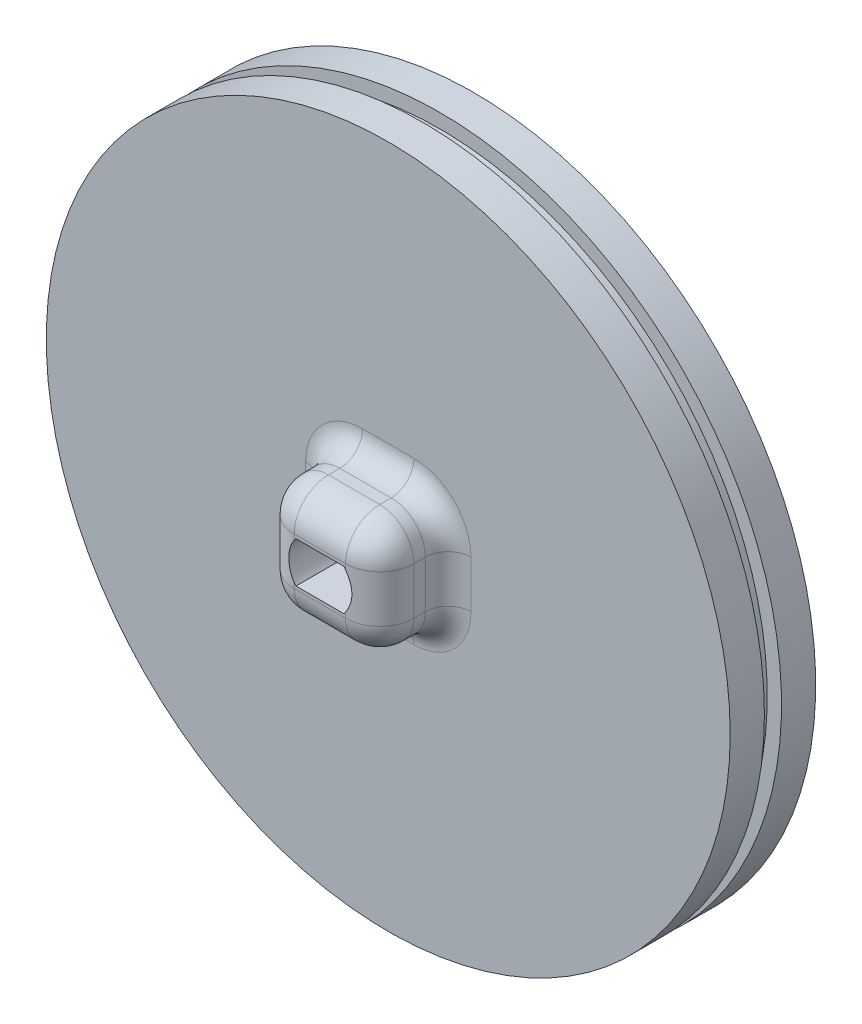
ISO-10303-21;
HEADER;
FILE_DESCRIPTION(('STEP AP214'),'2;1');
FILE_NAME('part.step','',(''),(''),'','','');
FILE_SCHEMA(('AUTOMOTIVE_DESIGN { 1 0 10303 214 1 1 1 1 }'));
ENDSEC;
DATA;
#1=APPLICATION_CONTEXT('core data for automotive mechanical design processes');
#2=APPLICATION_PROTOCOL_DEFINITION('international standard','automotive_design',2000,#1);
#3=PRODUCT_CONTEXT('',#1,'mechanical');
#4=PRODUCT('Part','Part','',(#3));
#5=PRODUCT_RELATED_PRODUCT_CATEGORY('part','',(#4));
#6=PRODUCT_DEFINITION_FORMATION('','',#4);
#7=PRODUCT_DEFINITION_CONTEXT('part definition',#1,'design');
#8=PRODUCT_DEFINITION('design','',#6,#7);
#9=PRODUCT_DEFINITION_SHAPE('','',#8);
#10=(LENGTH_UNIT() NAMED_UNIT(*) SI_UNIT(.MILLI.,.METRE.));
#11=(NAMED_UNIT(*) PLANE_ANGLE_UNIT() SI_UNIT($,.RADIAN.));
#12=(NAMED_UNIT(*) SI_UNIT($,.STERADIAN.) SOLID_ANGLE_UNIT());
#13=UNCERTAINTY_MEASURE_WITH_UNIT(LENGTH_MEASURE(1.E-05),#10,'distance_accuracy_value','');
#14=(GEOMETRIC_REPRESENTATION_CONTEXT(3) GLOBAL_UNCERTAINTY_ASSIGNED_CONTEXT((#13)) GLOBAL_UNIT_ASSIGNED_CONTEXT((#10,
#11,#12)) REPRESENTATION_CONTEXT('',''));
#15=CARTESIAN_POINT('',(0.,0.,0.));
#16=DIRECTION('',(0.,0.,1.));
#17=DIRECTION('',(1.,0.,0.));
#18=AXIS2_PLACEMENT_3D('',#15,#16,#17);
#19=CARTESIAN_POINT('',(0.,0.,9.));
#20=DIRECTION('',(0.,0.,1.));
#21=DIRECTION('',(1.,0.,0.));
#22=AXIS2_PLACEMENT_3D('',#19,#20,#21);
#23=PLANE('',#22);
#24=CARTESIAN_POINT('',(0.,0.,9.));
#25=DIRECTION('',(0.,0.,1.));
#26=DIRECTION('',(1.,0.,0.));
#27=AXIS2_PLACEMENT_3D('',#24,#25,#26);
#28=CIRCLE('',#27,2.76586333718787);
#29=CARTESIAN_POINT('',(-2.1,-1.8,9.));
#30=VERTEX_POINT('',#29);
#31=CARTESIAN_POINT('',(-2.25070691783825,-1.60758152825761,9.));
#32=VERTEX_POINT('',#31);
#33=EDGE_CURVE('E194',#30,#32,#28,.F.);
#34=ORIENTED_EDGE('',*,*,#33,.T.);
#35=DIRECTION('',(0.,1.,0.));
#36=VECTOR('',#35,1.);
#37=CARTESIAN_POINT('',(-2.25070691783825,0.,9.));
#38=LINE('',#37,#36);
#39=CARTESIAN_POINT('',(-2.25070691783825,-2.07228483810584,9.));
#40=VERTEX_POINT('',#39);
#41=EDGE_CURVE('E285',#32,#40,#38,.F.);
#42=ORIENTED_EDGE('',*,*,#41,.T.);
#43=DIRECTION('',(-1.,0.,0.));
#44=VECTOR('',#43,1.);
#45=CARTESIAN_POINT('',(0.,-2.07228483810584,9.));
#46=LINE('',#45,#44);
#47=CARTESIAN_POINT('',(2.25070691783825,-2.07228483810584,9.));
#48=VERTEX_POINT('',#47);
#49=EDGE_CURVE('E283',#40,#48,#46,.F.);
#50=ORIENTED_EDGE('',*,*,#49,.T.);
#51=DIRECTION('',(0.,1.,0.));
#52=VECTOR('',#51,1.);
#53=CARTESIAN_POINT('',(2.25070691783825,5.07228483810584,9.));
#54=LINE('',#53,#52);
#55=CARTESIAN_POINT('',(2.25070691783825,-1.60758152825761,9.));
#56=VERTEX_POINT('',#55);
#57=EDGE_CURVE('E281',#48,#56,#54,.T.);
#58=ORIENTED_EDGE('',*,*,#57,.T.);
#59=CARTESIAN_POINT('',(0.,0.,9.));
#60=DIRECTION('',(0.,0.,1.));
#61=DIRECTION('',(1.,0.,0.));
#62=AXIS2_PLACEMENT_3D('',#59,#60,#61);
#63=CIRCLE('',#62,2.76586333718787);
#64=CARTESIAN_POINT('',(2.1,-1.8,9.));
#65=VERTEX_POINT('',#64);
#66=EDGE_CURVE('E239',#56,#65,#63,.F.);
#67=ORIENTED_EDGE('',*,*,#66,.T.);
#68=DIRECTION('',(-1.,0.,0.));
#69=VECTOR('',#68,1.);
#70=CARTESIAN_POINT('',(0.,-1.8,9.));
#71=LINE('',#70,#69);
#72=EDGE_CURVE('E243',#65,#30,#71,.T.);
#73=ORIENTED_EDGE('',*,*,#72,.T.);
#74=EDGE_LOOP('',(#34,#42,#50,#58,#67,#73));
#75=FACE_BOUND('',#74,.T.);
#76=ADVANCED_FACE('F47',(#75),#23,.T.);
#77=CARTESIAN_POINT('',(0.,0.,3.));
#78=DIRECTION('',(0.,0.,-1.));
#79=DIRECTION('',(-1.,0.,0.));
#80=AXIS2_PLACEMENT_3D('',#77,#78,#79);
#81=CYLINDRICAL_SURFACE('',#80,30.);
#82=CARTESIAN_POINT('',(0.,0.,3.));
#83=DIRECTION('',(0.,0.,1.));
#84=DIRECTION('',(1.,0.,0.));
#85=AXIS2_PLACEMENT_3D('',#82,#83,#84);
#86=CIRCLE('',#85,30.);
#87=CARTESIAN_POINT('',(30.,0.,3.));
#88=VERTEX_POINT('',#87);
#89=EDGE_CURVE('E236',#88,#88,#86,.T.);
#90=ORIENTED_EDGE('',*,*,#89,.F.);
#91=EDGE_LOOP('',(#90));
#92=FACE_BOUND('',#91,.T.);
#93=CARTESIAN_POINT('',(0.,0.,0.));
#94=DIRECTION('',(0.,0.,1.));
#95=DIRECTION('',(1.,0.,0.));
#96=AXIS2_PLACEMENT_3D('',#93,#94,#95);
#97=CIRCLE('',#96,30.);
#98=CARTESIAN_POINT('',(30.,0.,0.));
#99=VERTEX_POINT('',#98);
#100=EDGE_CURVE('E248',#99,#99,#97,.T.);
#101=ORIENTED_EDGE('',*,*,#100,.T.);
#102=EDGE_LOOP('',(#101));
#103=FACE_BOUND('',#102,.T.);
#104=ADVANCED_FACE('F386',(#92,#103),#81,.T.);
#105=CARTESIAN_POINT('',(0.,0.,3.));
#106=DIRECTION('',(0.,0.,1.));
#107=DIRECTION('',(1.,0.,0.));
#108=AXIS2_PLACEMENT_3D('',#105,#106,#107);
#109=PLANE('',#108);
#110=DIRECTION('',(-1.,0.,0.));
#111=VECTOR('',#110,1.);
#112=CARTESIAN_POINT('',(0.,7.07228483810584,3.));
#113=LINE('',#112,#111);
#114=CARTESIAN_POINT('',(-2.25070691783825,7.07228483810584,3.));
#115=VERTEX_POINT('',#114);
#116=CARTESIAN_POINT('',(2.25070691783825,7.07228483810584,3.));
#117=VERTEX_POINT('',#116);
#118=EDGE_CURVE('E328',#115,#117,#113,.F.);
#119=ORIENTED_EDGE('',*,*,#118,.T.);
#120=CARTESIAN_POINT('',(2.25070691783825,2.07228483810584,3.));
#121=DIRECTION('',(0.,0.,1.));
#122=DIRECTION('',(1.,0.,0.));
#123=AXIS2_PLACEMENT_3D('',#120,#121,#122);
#124=CIRCLE('',#123,5.);
#125=CARTESIAN_POINT('',(7.25070691783825,2.07228483810584,3.));
#126=VERTEX_POINT('',#125);
#127=EDGE_CURVE('E467',#117,#126,#124,.F.);
#128=ORIENTED_EDGE('',*,*,#127,.T.);
#129=DIRECTION('',(0.,1.,0.));
#130=VECTOR('',#129,1.);
#131=CARTESIAN_POINT('',(7.25070691783825,0.,3.));
#132=LINE('',#131,#130);
#133=CARTESIAN_POINT('',(7.25070691783825,-2.07228483810584,3.));
#134=VERTEX_POINT('',#133);
#135=EDGE_CURVE('E465',#126,#134,#132,.F.);
#136=ORIENTED_EDGE('',*,*,#135,.T.);
#137=CARTESIAN_POINT('',(2.25070691783825,-2.07228483810584,3.));
#138=DIRECTION('',(0.,0.,1.));
#139=DIRECTION('',(1.,0.,0.));
#140=AXIS2_PLACEMENT_3D('',#137,#138,#139);
#141=CIRCLE('',#140,5.);
#142=CARTESIAN_POINT('',(2.25070691783825,-7.07228483810584,3.));
#143=VERTEX_POINT('',#142);
#144=EDGE_CURVE('E463',#134,#143,#141,.F.);
#145=ORIENTED_EDGE('',*,*,#144,.T.);
#146=DIRECTION('',(-1.,0.,0.));
#147=VECTOR('',#146,1.);
#148=CARTESIAN_POINT('',(-2.25070691783825,-7.07228483810584,3.));
#149=LINE('',#148,#147);
#150=CARTESIAN_POINT('',(-2.25070691783825,-7.07228483810584,3.));
#151=VERTEX_POINT('',#150);
#152=EDGE_CURVE('E461',#143,#151,#149,.T.);
#153=ORIENTED_EDGE('',*,*,#152,.T.);
#154=CARTESIAN_POINT('',(-2.25070691783825,-2.07228483810584,3.));
#155=DIRECTION('',(0.,0.,1.));
#156=DIRECTION('',(1.,0.,0.));
#157=AXIS2_PLACEMENT_3D('',#154,#155,#156);
#158=CIRCLE('',#157,5.);
#159=CARTESIAN_POINT('',(-7.25070691783825,-2.07228483810584,3.));
#160=VERTEX_POINT('',#159);
#161=EDGE_CURVE('E459',#151,#160,#158,.F.);
#162=ORIENTED_EDGE('',*,*,#161,.T.);
#163=DIRECTION('',(0.,1.,0.));
#164=VECTOR('',#163,1.);
#165=CARTESIAN_POINT('',(-7.25070691783825,2.07228483810584,3.));
#166=LINE('',#165,#164);
#167=CARTESIAN_POINT('',(-7.25070691783825,2.07228483810584,3.));
#168=VERTEX_POINT('',#167);
#169=EDGE_CURVE('E457',#160,#168,#166,.T.);
#170=ORIENTED_EDGE('',*,*,#169,.T.);
#171=CARTESIAN_POINT('',(-2.25070691783825,2.07228483810584,3.));
#172=DIRECTION('',(0.,0.,1.));
#173=DIRECTION('',(1.,0.,0.));
#174=AXIS2_PLACEMENT_3D('',#171,#172,#173);
#175=CIRCLE('',#174,5.);
#176=EDGE_CURVE('E455',#168,#115,#175,.F.);
#177=ORIENTED_EDGE('',*,*,#176,.T.);
#178=EDGE_LOOP('',(#119,#128,#136,#145,#153,#162,#170,#177));
#179=FACE_BOUND('',#178,.T.);
#180=ORIENTED_EDGE('',*,*,#89,.T.);
#181=EDGE_LOOP('',(#180));
#182=FACE_BOUND('',#181,.T.);
#183=ADVANCED_FACE('F317',(#179,#182),#109,.T.);
#184=CARTESIAN_POINT('',(0.,0.,0.));
#185=DIRECTION('',(0.,0.,1.));
#186=DIRECTION('',(1.,0.,0.));
#187=AXIS2_PLACEMENT_3D('',#184,#185,#186);
#188=PLANE('',#187);
#189=CARTESIAN_POINT('',(0.,0.,0.));
#190=DIRECTION('',(0.,0.,-1.));
#191=DIRECTION('',(-1.,0.,0.));
#192=AXIS2_PLACEMENT_3D('',#189,#190,#191);
#193=CIRCLE('',#192,28.75);
#194=CARTESIAN_POINT('',(-28.75,0.,0.));
#195=VERTEX_POINT('',#194);
#196=EDGE_CURVE('E232',#195,#195,#193,.T.);
#197=ORIENTED_EDGE('',*,*,#196,.F.);
#198=EDGE_LOOP('',(#197));
#199=FACE_BOUND('',#198,.T.);
#200=ORIENTED_EDGE('',*,*,#100,.F.);
#201=EDGE_LOOP('',(#200));
#202=FACE_BOUND('',#201,.T.);
#203=ADVANCED_FACE('F315',(#199,#202),#188,.F.);
#204=CARTESIAN_POINT('',(0.,0.,0.));
#205=DIRECTION('',(0.,0.,1.));
#206=DIRECTION('',(1.,0.,0.));
#207=AXIS2_PLACEMENT_3D('',#204,#205,#206);
#208=CYLINDRICAL_SURFACE('',#207,2.76586333718787);
#209=ORIENTED_EDGE('',*,*,#66,.F.);
#210=CARTESIAN_POINT('',(2.25070691783825,-1.60758152825761,9.));
#211=CARTESIAN_POINT('',(2.29579151730118,-1.54447324654785,8.99999076770363));
#212=CARTESIAN_POINT('',(2.33819924072402,-1.47947465190742,8.99898344435618));
#213=CARTESIAN_POINT('',(2.41739040970937,-1.34618758582439,8.99563035944665));
#214=CARTESIAN_POINT('',(2.45417513150772,-1.27789986554581,8.99328490217042));
#215=CARTESIAN_POINT('',(2.52187065480421,-1.13849586622718,8.98791267953742));
#216=CARTESIAN_POINT('',(2.55278143027582,-1.06737957465586,8.984885911162));
#217=CARTESIAN_POINT('',(2.60852412576171,-0.922827690382631,8.97871559453631));
#218=CARTESIAN_POINT('',(2.63335583147673,-0.849392016020883,8.97557204217366));
#219=CARTESIAN_POINT('',(2.69845737679608,-0.62631430754172,8.96673199214799));
#220=CARTESIAN_POINT('',(2.72938549330813,-0.473794586844061,8.96162044557408));
#221=CARTESIAN_POINT('',(2.76523983615542,-0.165808780765627,8.9556027990261));
#222=CARTESIAN_POINT('',(2.77018266697124,-0.0103446406189434,8.9546940135513));
#223=CARTESIAN_POINT('',(2.75404748101315,0.298237310513385,8.95748382936359));
#224=CARTESIAN_POINT('',(2.73312711232855,0.451363633596343,8.96115451789465));
#225=CARTESIAN_POINT('',(2.66613459131712,0.751953886793514,8.97128757643424));
#226=CARTESIAN_POINT('',(2.62006001199888,0.899417269052007,8.97775021581021));
#227=CARTESIAN_POINT('',(2.52142894124265,1.14195325084686,8.98803717837981));
#228=CARTESIAN_POINT('',(2.47491752875701,1.23952006053021,8.99207302801525));
#229=CARTESIAN_POINT('',(2.37089874274885,1.42845007106684,8.99803441253971));
#230=CARTESIAN_POINT('',(2.31341013414833,1.51982350311286,8.99996351152751));
#231=CARTESIAN_POINT('',(2.25070691783825,1.6075815282576,9.));
#232=B_SPLINE_CURVE_WITH_KNOTS('',3,(#210,#211,#212,#213,#214,#215,#216,#217,#218,#219,#220,
#221,#222,#223,#224,#225,#226,#227,#228,#229,#230,#231),.UNSPECIFIED.,.F.,.F.,(4,2,2,2,2,2,2,2,
2,2,4),(0.,0.23257344322412,0.465094021322319,0.69761562965846,0.930145433662444,
1.39485238838361,1.85926236132763,2.32085544687902,2.78249307688075,3.10626561289607,
3.42948955360998),.UNSPECIFIED.);
#233=CARTESIAN_POINT('',(2.25070691783825,1.6075815282576,9.));
#234=VERTEX_POINT('',#233);
#235=EDGE_CURVE('E320',#56,#234,#232,.T.);
#236=ORIENTED_EDGE('',*,*,#235,.T.);
#237=CARTESIAN_POINT('',(2.1,1.8,9.));
#238=VERTEX_POINT('',#237);
#239=EDGE_CURVE('E240',#238,#234,#63,.F.);
#240=ORIENTED_EDGE('',*,*,#239,.F.);
#241=DIRECTION('',(0.,0.,1.));
#242=VECTOR('',#241,1.);
#243=CARTESIAN_POINT('',(2.1,1.8,0.));
#244=LINE('',#243,#242);
#245=CARTESIAN_POINT('',(2.1,1.8,-4.5));
#246=VERTEX_POINT('',#245);
#247=EDGE_CURVE('E247',#246,#238,#244,.T.);
#248=ORIENTED_EDGE('',*,*,#247,.F.);
#249=CARTESIAN_POINT('',(0.,0.,-4.5));
#250=DIRECTION('',(0.,0.,1.));
#251=DIRECTION('',(-1.,0.,0.));
#252=AXIS2_PLACEMENT_3D('',#249,#250,#251);
#253=CIRCLE('',#252,2.76586333718787);
#254=CARTESIAN_POINT('',(2.1,-1.8,-4.5));
#255=VERTEX_POINT('',#254);
#256=EDGE_CURVE('E208',#255,#246,#253,.T.);
#257=ORIENTED_EDGE('',*,*,#256,.F.);
#258=DIRECTION('',(0.,0.,1.));
#259=VECTOR('',#258,1.);
#260=CARTESIAN_POINT('',(2.1,-1.8,0.));
#261=LINE('',#260,#259);
#262=EDGE_CURVE('E198',#255,#65,#261,.T.);
#263=ORIENTED_EDGE('',*,*,#262,.T.);
#264=EDGE_LOOP('',(#209,#236,#240,#248,#257,#263));
#265=FACE_BOUND('',#264,.T.);
#266=ADVANCED_FACE('F311',(#265),#208,.F.);
#267=CARTESIAN_POINT('',(-2.1,-1.8,0.));
#268=DIRECTION('',(0.,-1.,0.));
#269=DIRECTION('',(0.,0.,-1.));
#270=AXIS2_PLACEMENT_3D('',#267,#268,#269);
#271=PLANE('',#270);
#272=DIRECTION('',(0.,0.,1.));
#273=VECTOR('',#272,1.);
#274=CARTESIAN_POINT('',(-2.1,-1.8,0.));
#275=LINE('',#274,#273);
#276=CARTESIAN_POINT('',(-2.1,-1.8,-4.5));
#277=VERTEX_POINT('',#276);
#278=EDGE_CURVE('E185',#277,#30,#275,.T.);
#279=ORIENTED_EDGE('',*,*,#278,.T.);
#280=ORIENTED_EDGE('',*,*,#72,.F.);
#281=ORIENTED_EDGE('',*,*,#262,.F.);
#282=DIRECTION('',(1.,0.,0.));
#283=VECTOR('',#282,1.);
#284=CARTESIAN_POINT('',(2.1,-1.8,-4.5));
#285=LINE('',#284,#283);
#286=EDGE_CURVE('E202',#277,#255,#285,.T.);
#287=ORIENTED_EDGE('',*,*,#286,.F.);
#288=EDGE_LOOP('',(#279,#280,#281,#287));
#289=FACE_BOUND('',#288,.T.);
#290=ADVANCED_FACE('F203',(#289),#271,.F.);
#291=CARTESIAN_POINT('',(0.,0.,0.));
#292=DIRECTION('',(0.,0.,1.));
#293=DIRECTION('',(1.,0.,0.));
#294=AXIS2_PLACEMENT_3D('',#291,#292,#293);
#295=CYLINDRICAL_SURFACE('',#294,2.76586333718787);
#296=CARTESIAN_POINT('',(-2.25070691783825,1.6075815282576,9.));
#297=VERTEX_POINT('',#296);
#298=CARTESIAN_POINT('',(-2.1,1.8,9.));
#299=VERTEX_POINT('',#298);
#300=EDGE_CURVE('E245',#297,#299,#28,.F.);
#301=ORIENTED_EDGE('',*,*,#300,.F.);
#302=CARTESIAN_POINT('',(-2.25070691783825,1.6075815282576,9.));
#303=CARTESIAN_POINT('',(-2.29579151730118,1.54447324654785,8.99999076770363));
#304=CARTESIAN_POINT('',(-2.33819924072402,1.47947465190742,8.99898344435618));
#305=CARTESIAN_POINT('',(-2.41739040970937,1.34618758582439,8.99563035944665));
#306=CARTESIAN_POINT('',(-2.45417513150772,1.27789986554581,8.99328490217042));
#307=CARTESIAN_POINT('',(-2.52187065480421,1.13849586622718,8.98791267953742));
#308=CARTESIAN_POINT('',(-2.55278143027582,1.06737957465586,8.984885911162));
#309=CARTESIAN_POINT('',(-2.60852412576171,0.922827690382631,8.97871559453631));
#310=CARTESIAN_POINT('',(-2.63335583147673,0.849392016020882,8.97557204217366));
#311=CARTESIAN_POINT('',(-2.69845737679608,0.62631430754172,8.96673199214799));
#312=CARTESIAN_POINT('',(-2.72938549330814,0.473794586844061,8.96162044557408));
#313=CARTESIAN_POINT('',(-2.76523983615542,0.165808780765626,8.9556027990261));
#314=CARTESIAN_POINT('',(-2.77018266697124,0.0103446406189428,8.9546940135513));
#315=CARTESIAN_POINT('',(-2.75404748101315,-0.298237310513386,8.95748382936359));
#316=CARTESIAN_POINT('',(-2.73312711232855,-0.451363633596344,8.96115451789465));
#317=CARTESIAN_POINT('',(-2.66613459131712,-0.751953886793515,8.97128757643424));
#318=CARTESIAN_POINT('',(-2.62006001199888,-0.899417269052008,8.97775021581021));
#319=CARTESIAN_POINT('',(-2.52142894124265,-1.14195325084686,8.98803717837981));
#320=CARTESIAN_POINT('',(-2.47491752875701,-1.23952006053021,8.99207302801525));
#321=CARTESIAN_POINT('',(-2.37089874274885,-1.42845007106684,8.99803441253971));
#322=CARTESIAN_POINT('',(-2.31341013414833,-1.51982350311286,8.99996351152751));
#323=CARTESIAN_POINT('',(-2.25070691783825,-1.60758152825761,9.));
#324=B_SPLINE_CURVE_WITH_KNOTS('',3,(#302,#303,#304,#305,#306,#307,#308,#309,#310,#311,#312,
#313,#314,#315,#316,#317,#318,#319,#320,#321,#322,#323),.UNSPECIFIED.,.F.,.F.,(4,2,2,2,2,2,2,2,
2,2,4),(0.,0.23257344322412,0.46509402132232,0.69761562965846,0.930145433662444,
1.39485238838361,1.85926236132763,2.32085544687902,2.78249307688075,3.10626561289607,
3.42948955360998),.UNSPECIFIED.);
#325=EDGE_CURVE('E287',#297,#32,#324,.T.);
#326=ORIENTED_EDGE('',*,*,#325,.T.);
#327=ORIENTED_EDGE('',*,*,#33,.F.);
#328=ORIENTED_EDGE('',*,*,#278,.F.);
#329=CARTESIAN_POINT('',(0.,0.,-4.5));
#330=DIRECTION('',(0.,0.,1.));
#331=DIRECTION('',(1.,0.,0.));
#332=AXIS2_PLACEMENT_3D('',#329,#330,#331);
#333=CIRCLE('',#332,2.76586333718787);
#334=CARTESIAN_POINT('',(-2.1,1.8,-4.5));
#335=VERTEX_POINT('',#334);
#336=EDGE_CURVE('E191',#335,#277,#333,.T.);
#337=ORIENTED_EDGE('',*,*,#336,.F.);
#338=DIRECTION('',(0.,0.,1.));
#339=VECTOR('',#338,1.);
#340=CARTESIAN_POINT('',(-2.1,1.8,0.));
#341=LINE('',#340,#339);
#342=EDGE_CURVE('E199',#335,#299,#341,.T.);
#343=ORIENTED_EDGE('',*,*,#342,.T.);
#344=EDGE_LOOP('',(#301,#326,#327,#328,#337,#343));
#345=FACE_BOUND('',#344,.T.);
#346=ADVANCED_FACE('F188',(#345),#295,.F.);
#347=CARTESIAN_POINT('',(-2.1,1.8,0.));
#348=DIRECTION('',(0.,1.,0.));
#349=DIRECTION('',(0.,0.,1.));
#350=AXIS2_PLACEMENT_3D('',#347,#348,#349);
#351=PLANE('',#350);
#352=ORIENTED_EDGE('',*,*,#247,.T.);
#353=DIRECTION('',(1.,0.,0.));
#354=VECTOR('',#353,1.);
#355=CARTESIAN_POINT('',(0.,1.8,9.));
#356=LINE('',#355,#354);
#357=EDGE_CURVE('E231',#299,#238,#356,.T.);
#358=ORIENTED_EDGE('',*,*,#357,.F.);
#359=ORIENTED_EDGE('',*,*,#342,.F.);
#360=DIRECTION('',(-1.,0.,0.));
#361=VECTOR('',#360,1.);
#362=CARTESIAN_POINT('',(-2.1,1.8,-4.5));
#363=LINE('',#362,#361);
#364=EDGE_CURVE('E213',#246,#335,#363,.T.);
#365=ORIENTED_EDGE('',*,*,#364,.F.);
#366=EDGE_LOOP('',(#352,#358,#359,#365));
#367=FACE_BOUND('',#366,.T.);
#368=ADVANCED_FACE('F305',(#367),#351,.F.);
#369=CARTESIAN_POINT('',(-5.25070691783825,0.,9.));
#370=DIRECTION('',(-1.,0.,0.));
#371=DIRECTION('',(0.,0.,1.));
#372=AXIS2_PLACEMENT_3D('',#369,#370,#371);
#373=PLANE('',#372);
#374=DIRECTION('',(0.,0.,-1.));
#375=VECTOR('',#374,1.);
#376=CARTESIAN_POINT('',(-5.25070691783825,2.07228483810584,3.));
#377=LINE('',#376,#375);
#378=CARTESIAN_POINT('',(-5.25070691783825,2.07228483810584,6.));
#379=VERTEX_POINT('',#378);
#380=CARTESIAN_POINT('',(-5.25070691783825,2.07228483810584,5.));
#381=VERTEX_POINT('',#380);
#382=EDGE_CURVE('E259',#379,#381,#377,.T.);
#383=ORIENTED_EDGE('',*,*,#382,.T.);
#384=DIRECTION('',(0.,1.,0.));
#385=VECTOR('',#384,1.);
#386=CARTESIAN_POINT('',(-5.25070691783825,-2.07228483810584,5.));
#387=LINE('',#386,#385);
#388=CARTESIAN_POINT('',(-5.25070691783825,-2.07228483810584,5.));
#389=VERTEX_POINT('',#388);
#390=EDGE_CURVE('E481',#381,#389,#387,.F.);
#391=ORIENTED_EDGE('',*,*,#390,.T.);
#392=DIRECTION('',(0.,0.,-1.));
#393=VECTOR('',#392,1.);
#394=CARTESIAN_POINT('',(-5.25070691783825,-2.07228483810584,9.));
#395=LINE('',#394,#393);
#396=CARTESIAN_POINT('',(-5.25070691783825,-2.07228483810584,6.));
#397=VERTEX_POINT('',#396);
#398=EDGE_CURVE('E257',#389,#397,#395,.F.);
#399=ORIENTED_EDGE('',*,*,#398,.T.);
#400=DIRECTION('',(0.,1.,0.));
#401=VECTOR('',#400,1.);
#402=CARTESIAN_POINT('',(-5.25070691783825,0.,6.));
#403=LINE('',#402,#401);
#404=EDGE_CURVE('E235',#397,#379,#403,.T.);
#405=ORIENTED_EDGE('',*,*,#404,.T.);
#406=EDGE_LOOP('',(#383,#391,#399,#405));
#407=FACE_BOUND('',#406,.T.);
#408=ADVANCED_FACE('F309',(#407),#373,.T.);
#409=CARTESIAN_POINT('',(0.,-5.07228483810584,9.));
#410=DIRECTION('',(0.,-1.,0.));
#411=DIRECTION('',(0.,0.,-1.));
#412=AXIS2_PLACEMENT_3D('',#409,#410,#411);
#413=PLANE('',#412);
#414=DIRECTION('',(0.,0.,-1.));
#415=VECTOR('',#414,1.);
#416=CARTESIAN_POINT('',(-2.25070691783825,-5.07228483810584,9.));
#417=LINE('',#416,#415);
#418=CARTESIAN_POINT('',(-2.25070691783825,-5.07228483810584,6.));
#419=VERTEX_POINT('',#418);
#420=CARTESIAN_POINT('',(-2.25070691783825,-5.07228483810584,5.));
#421=VERTEX_POINT('',#420);
#422=EDGE_CURVE('E271',#419,#421,#417,.T.);
#423=ORIENTED_EDGE('',*,*,#422,.T.);
#424=DIRECTION('',(-1.,0.,0.));
#425=VECTOR('',#424,1.);
#426=CARTESIAN_POINT('',(2.25070691783825,-5.07228483810584,5.));
#427=LINE('',#426,#425);
#428=CARTESIAN_POINT('',(2.25070691783825,-5.07228483810584,5.));
#429=VERTEX_POINT('',#428);
#430=EDGE_CURVE('E477',#421,#429,#427,.F.);
#431=ORIENTED_EDGE('',*,*,#430,.T.);
#432=DIRECTION('',(0.,0.,-1.));
#433=VECTOR('',#432,1.);
#434=CARTESIAN_POINT('',(2.25070691783825,-5.07228483810584,9.));
#435=LINE('',#434,#433);
#436=CARTESIAN_POINT('',(2.25070691783825,-5.07228483810584,6.));
#437=VERTEX_POINT('',#436);
#438=EDGE_CURVE('E267',#429,#437,#435,.F.);
#439=ORIENTED_EDGE('',*,*,#438,.T.);
#440=DIRECTION('',(-1.,0.,0.));
#441=VECTOR('',#440,1.);
#442=CARTESIAN_POINT('',(0.,-5.07228483810584,6.));
#443=LINE('',#442,#441);
#444=EDGE_CURVE('E269',#437,#419,#443,.T.);
#445=ORIENTED_EDGE('',*,*,#444,.T.);
#446=EDGE_LOOP('',(#423,#431,#439,#445));
#447=FACE_BOUND('',#446,.T.);
#448=ADVANCED_FACE('F517',(#447),#413,.T.);
#449=CARTESIAN_POINT('',(5.25070691783825,0.,9.));
#450=DIRECTION('',(-1.,0.,0.));
#451=DIRECTION('',(0.,0.,1.));
#452=AXIS2_PLACEMENT_3D('',#449,#450,#451);
#453=PLANE('',#452);
#454=DIRECTION('',(0.,0.,-1.));
#455=VECTOR('',#454,1.);
#456=CARTESIAN_POINT('',(5.25070691783825,-2.07228483810584,3.));
#457=LINE('',#456,#455);
#458=CARTESIAN_POINT('',(5.25070691783825,-2.07228483810584,6.));
#459=VERTEX_POINT('',#458);
#460=CARTESIAN_POINT('',(5.25070691783825,-2.07228483810584,5.));
#461=VERTEX_POINT('',#460);
#462=EDGE_CURVE('E329',#459,#461,#457,.T.);
#463=ORIENTED_EDGE('',*,*,#462,.T.);
#464=DIRECTION('',(0.,1.,0.));
#465=VECTOR('',#464,1.);
#466=CARTESIAN_POINT('',(5.25070691783825,0.,5.));
#467=LINE('',#466,#465);
#468=CARTESIAN_POINT('',(5.25070691783825,2.07228483810584,5.));
#469=VERTEX_POINT('',#468);
#470=EDGE_CURVE('E473',#461,#469,#467,.T.);
#471=ORIENTED_EDGE('',*,*,#470,.T.);
#472=DIRECTION('',(0.,0.,-1.));
#473=VECTOR('',#472,1.);
#474=CARTESIAN_POINT('',(5.25070691783825,2.07228483810584,9.));
#475=LINE('',#474,#473);
#476=CARTESIAN_POINT('',(5.25070691783825,2.07228483810584,6.));
#477=VERTEX_POINT('',#476);
#478=EDGE_CURVE('E295',#469,#477,#475,.F.);
#479=ORIENTED_EDGE('',*,*,#478,.T.);
#480=DIRECTION('',(0.,1.,0.));
#481=VECTOR('',#480,1.);
#482=CARTESIAN_POINT('',(5.25070691783825,-5.07228483810584,6.));
#483=LINE('',#482,#481);
#484=EDGE_CURVE('E546',#477,#459,#483,.F.);
#485=ORIENTED_EDGE('',*,*,#484,.T.);
#486=EDGE_LOOP('',(#463,#471,#479,#485));
#487=FACE_BOUND('',#486,.T.);
#488=ADVANCED_FACE('F408',(#487),#453,.F.);
#489=CARTESIAN_POINT('',(0.,5.07228483810584,9.));
#490=DIRECTION('',(0.,-1.,0.));
#491=DIRECTION('',(0.,0.,-1.));
#492=AXIS2_PLACEMENT_3D('',#489,#490,#491);
#493=PLANE('',#492);
#494=DIRECTION('',(0.,0.,-1.));
#495=VECTOR('',#494,1.);
#496=CARTESIAN_POINT('',(2.25070691783825,5.07228483810584,9.));
#497=LINE('',#496,#495);
#498=CARTESIAN_POINT('',(2.25070691783825,5.07228483810584,6.));
#499=VERTEX_POINT('',#498);
#500=CARTESIAN_POINT('',(2.25070691783825,5.07228483810584,5.));
#501=VERTEX_POINT('',#500);
#502=EDGE_CURVE('E263',#499,#501,#497,.T.);
#503=ORIENTED_EDGE('',*,*,#502,.T.);
#504=DIRECTION('',(-1.,0.,0.));
#505=VECTOR('',#504,1.);
#506=CARTESIAN_POINT('',(0.,5.07228483810584,5.));
#507=LINE('',#506,#505);
#508=CARTESIAN_POINT('',(-2.25070691783825,5.07228483810584,5.));
#509=VERTEX_POINT('',#508);
#510=EDGE_CURVE('E11',#501,#509,#507,.T.);
#511=ORIENTED_EDGE('',*,*,#510,.T.);
#512=DIRECTION('',(0.,0.,-1.));
#513=VECTOR('',#512,1.);
#514=CARTESIAN_POINT('',(-2.25070691783825,5.07228483810584,9.));
#515=LINE('',#514,#513);
#516=CARTESIAN_POINT('',(-2.25070691783825,5.07228483810584,6.));
#517=VERTEX_POINT('',#516);
#518=EDGE_CURVE('E265',#509,#517,#515,.F.);
#519=ORIENTED_EDGE('',*,*,#518,.T.);
#520=DIRECTION('',(-1.,0.,0.));
#521=VECTOR('',#520,1.);
#522=CARTESIAN_POINT('',(5.25070691783825,5.07228483810584,6.));
#523=LINE('',#522,#521);
#524=EDGE_CURVE('E261',#517,#499,#523,.F.);
#525=ORIENTED_EDGE('',*,*,#524,.T.);
#526=EDGE_LOOP('',(#503,#511,#519,#525));
#527=FACE_BOUND('',#526,.T.);
#528=ADVANCED_FACE('F400',(#527),#493,.F.);
#529=DIRECTION('',(-1.,0.,0.));
#530=VECTOR('',#529,1.);
#531=CARTESIAN_POINT('',(-5.25070691783825,2.07228483810584,9.));
#532=LINE('',#531,#530);
#533=CARTESIAN_POINT('',(2.25070691783825,2.07228483810584,9.));
#534=VERTEX_POINT('',#533);
#535=CARTESIAN_POINT('',(-2.25070691783825,2.07228483810584,9.));
#536=VERTEX_POINT('',#535);
#537=EDGE_CURVE('E274',#534,#536,#532,.T.);
#538=ORIENTED_EDGE('',*,*,#537,.T.);
#539=DIRECTION('',(0.,1.,0.));
#540=VECTOR('',#539,1.);
#541=CARTESIAN_POINT('',(-2.25070691783825,0.,9.));
#542=LINE('',#541,#540);
#543=EDGE_CURVE('E278',#536,#297,#542,.F.);
#544=ORIENTED_EDGE('',*,*,#543,.T.);
#545=ORIENTED_EDGE('',*,*,#300,.T.);
#546=ORIENTED_EDGE('',*,*,#357,.T.);
#547=ORIENTED_EDGE('',*,*,#239,.T.);
#548=DIRECTION('',(0.,1.,0.));
#549=VECTOR('',#548,1.);
#550=CARTESIAN_POINT('',(2.25070691783825,5.07228483810584,9.));
#551=LINE('',#550,#549);
#552=EDGE_CURVE('E276',#234,#534,#551,.T.);
#553=ORIENTED_EDGE('',*,*,#552,.T.);
#554=EDGE_LOOP('',(#538,#544,#545,#546,#547,#553));
#555=FACE_BOUND('',#554,.T.);
#556=ADVANCED_FACE('F389',(#555),#23,.T.);
#557=CARTESIAN_POINT('',(0.,0.,-1.5));
#558=DIRECTION('',(0.,0.,1.));
#559=DIRECTION('',(1.,0.,0.));
#560=AXIS2_PLACEMENT_3D('',#557,#558,#559);
#561=CYLINDRICAL_SURFACE('',#560,28.75);
#562=CARTESIAN_POINT('',(0.,0.,-1.5));
#563=DIRECTION('',(0.,0.,-1.));
#564=DIRECTION('',(-1.,0.,0.));
#565=AXIS2_PLACEMENT_3D('',#562,#563,#564);
#566=CIRCLE('',#565,28.75);
#567=CARTESIAN_POINT('',(-28.75,0.,-1.5));
#568=VERTEX_POINT('',#567);
#569=EDGE_CURVE('E226',#568,#568,#566,.T.);
#570=ORIENTED_EDGE('',*,*,#569,.F.);
#571=EDGE_LOOP('',(#570));
#572=FACE_BOUND('',#571,.T.);
#573=ORIENTED_EDGE('',*,*,#196,.T.);
#574=EDGE_LOOP('',(#573));
#575=FACE_BOUND('',#574,.T.);
#576=ADVANCED_FACE('F399',(#572,#575),#561,.T.);
#577=CARTESIAN_POINT('',(0.,0.,-4.5));
#578=DIRECTION('',(0.,0.,1.));
#579=DIRECTION('',(1.,0.,0.));
#580=AXIS2_PLACEMENT_3D('',#577,#578,#579);
#581=CYLINDRICAL_SURFACE('',#580,30.);
#582=CARTESIAN_POINT('',(0.,0.,-4.5));
#583=DIRECTION('',(0.,0.,-1.));
#584=DIRECTION('',(-1.,0.,0.));
#585=AXIS2_PLACEMENT_3D('',#582,#583,#584);
#586=CIRCLE('',#585,30.);
#587=CARTESIAN_POINT('',(-30.,0.,-4.5));
#588=VERTEX_POINT('',#587);
#589=EDGE_CURVE('E223',#588,#588,#586,.T.);
#590=ORIENTED_EDGE('',*,*,#589,.F.);
#591=EDGE_LOOP('',(#590));
#592=FACE_BOUND('',#591,.T.);
#593=CARTESIAN_POINT('',(0.,0.,-1.5));
#594=DIRECTION('',(0.,0.,-1.));
#595=DIRECTION('',(-1.,0.,0.));
#596=AXIS2_PLACEMENT_3D('',#593,#594,#595);
#597=CIRCLE('',#596,30.);
#598=CARTESIAN_POINT('',(-30.,0.,-1.5));
#599=VERTEX_POINT('',#598);
#600=EDGE_CURVE('E222',#599,#599,#597,.T.);
#601=ORIENTED_EDGE('',*,*,#600,.T.);
#602=EDGE_LOOP('',(#601));
#603=FACE_BOUND('',#602,.T.);
#604=ADVANCED_FACE('F405',(#592,#603),#581,.T.);
#605=CARTESIAN_POINT('',(0.,0.,-4.5));
#606=DIRECTION('',(0.,0.,-1.));
#607=DIRECTION('',(-1.,0.,0.));
#608=AXIS2_PLACEMENT_3D('',#605,#606,#607);
#609=PLANE('',#608);
#610=ORIENTED_EDGE('',*,*,#336,.T.);
#611=ORIENTED_EDGE('',*,*,#286,.T.);
#612=ORIENTED_EDGE('',*,*,#256,.T.);
#613=ORIENTED_EDGE('',*,*,#364,.T.);
#614=EDGE_LOOP('',(#610,#611,#612,#613));
#615=FACE_BOUND('',#614,.T.);
#616=ORIENTED_EDGE('',*,*,#589,.T.);
#617=EDGE_LOOP('',(#616));
#618=FACE_BOUND('',#617,.T.);
#619=ADVANCED_FACE('F210',(#615,#618),#609,.T.);
#620=CARTESIAN_POINT('',(0.,0.,-1.5));
#621=DIRECTION('',(0.,0.,-1.));
#622=DIRECTION('',(-1.,0.,0.));
#623=AXIS2_PLACEMENT_3D('',#620,#621,#622);
#624=PLANE('',#623);
#625=ORIENTED_EDGE('',*,*,#569,.T.);
#626=EDGE_LOOP('',(#625));
#627=FACE_BOUND('',#626,.T.);
#628=ORIENTED_EDGE('',*,*,#600,.F.);
#629=EDGE_LOOP('',(#628));
#630=FACE_BOUND('',#629,.T.);
#631=ADVANCED_FACE('F351',(#627,#630),#624,.F.);
#632=CARTESIAN_POINT('',(2.25070691783825,-2.07228483810584,9.));
#633=DIRECTION('',(0.,0.,1.));
#634=DIRECTION('',(1.,0.,0.));
#635=AXIS2_PLACEMENT_3D('',#632,#633,#634);
#636=CYLINDRICAL_SURFACE('',#635,3.);
#637=ORIENTED_EDGE('',*,*,#438,.F.);
#638=CARTESIAN_POINT('',(2.25070691783825,-2.07228483810584,5.));
#639=DIRECTION('',(0.,0.,1.));
#640=DIRECTION('',(1.,0.,0.));
#641=AXIS2_PLACEMENT_3D('',#638,#639,#640);
#642=CIRCLE('',#641,3.);
#643=EDGE_CURVE('E475',#429,#461,#642,.T.);
#644=ORIENTED_EDGE('',*,*,#643,.T.);
#645=ORIENTED_EDGE('',*,*,#462,.F.);
#646=CARTESIAN_POINT('',(2.25070691783825,-2.07228483810584,6.));
#647=DIRECTION('',(0.,0.,1.));
#648=DIRECTION('',(1.,0.,0.));
#649=AXIS2_PLACEMENT_3D('',#646,#647,#648);
#650=CIRCLE('',#649,3.);
#651=EDGE_CURVE('E214',#437,#459,#650,.T.);
#652=ORIENTED_EDGE('',*,*,#651,.F.);
#653=EDGE_LOOP('',(#637,#644,#645,#652));
#654=FACE_BOUND('',#653,.T.);
#655=ADVANCED_FACE('F347',(#654),#636,.T.);
#656=CARTESIAN_POINT('',(2.25070691783825,-2.07228483810584,6.));
#657=DIRECTION('',(1.,0.,0.));
#658=DIRECTION('',(0.,0.,-1.));
#659=AXIS2_PLACEMENT_3D('',#656,#657,#658);
#660=SPHERICAL_SURFACE('',#659,3.);
#661=CARTESIAN_POINT('',(2.25070691783825,-2.07228483810584,6.));
#662=DIRECTION('',(1.,0.,0.));
#663=DIRECTION('',(0.,0.,-1.));
#664=AXIS2_PLACEMENT_3D('',#661,#662,#663);
#665=CIRCLE('',#664,3.);
#666=EDGE_CURVE('E449',#437,#48,#665,.F.);
#667=ORIENTED_EDGE('',*,*,#666,.F.);
#668=ORIENTED_EDGE('',*,*,#651,.T.);
#669=CARTESIAN_POINT('',(2.25070691783825,-2.07228483810584,6.));
#670=DIRECTION('',(0.,-1.,0.));
#671=DIRECTION('',(0.,0.,-1.));
#672=AXIS2_PLACEMENT_3D('',#669,#670,#671);
#673=CIRCLE('',#672,3.);
#674=EDGE_CURVE('E217',#48,#459,#673,.F.);
#675=ORIENTED_EDGE('',*,*,#674,.F.);
#676=EDGE_LOOP('',(#667,#668,#675));
#677=FACE_BOUND('',#676,.T.);
#678=ADVANCED_FACE('F343',(#677),#660,.T.);
#679=CARTESIAN_POINT('',(2.25070691783825,2.07228483810584,9.));
#680=DIRECTION('',(0.,0.,-1.));
#681=DIRECTION('',(-1.,0.,0.));
#682=AXIS2_PLACEMENT_3D('',#679,#680,#681);
#683=CYLINDRICAL_SURFACE('',#682,3.);
#684=ORIENTED_EDGE('',*,*,#478,.F.);
#685=CARTESIAN_POINT('',(2.25070691783825,2.07228483810584,5.));
#686=DIRECTION('',(0.,0.,1.));
#687=DIRECTION('',(1.,0.,0.));
#688=AXIS2_PLACEMENT_3D('',#685,#686,#687);
#689=CIRCLE('',#688,3.);
#690=EDGE_CURVE('E470',#469,#501,#689,.T.);
#691=ORIENTED_EDGE('',*,*,#690,.T.);
#692=ORIENTED_EDGE('',*,*,#502,.F.);
#693=CARTESIAN_POINT('',(2.25070691783825,2.07228483810584,6.));
#694=DIRECTION('',(0.,0.,1.));
#695=DIRECTION('',(1.,0.,0.));
#696=AXIS2_PLACEMENT_3D('',#693,#694,#695);
#697=CIRCLE('',#696,3.);
#698=EDGE_CURVE('E446',#477,#499,#697,.T.);
#699=ORIENTED_EDGE('',*,*,#698,.F.);
#700=EDGE_LOOP('',(#684,#691,#692,#699));
#701=FACE_BOUND('',#700,.T.);
#702=ADVANCED_FACE('F338',(#701),#683,.T.);
#703=CARTESIAN_POINT('',(2.25070691783825,0.,6.));
#704=DIRECTION('',(0.,-1.,0.));
#705=DIRECTION('',(0.,0.,-1.));
#706=AXIS2_PLACEMENT_3D('',#703,#704,#705);
#707=CYLINDRICAL_SURFACE('',#706,3.);
#708=ORIENTED_EDGE('',*,*,#674,.T.);
#709=ORIENTED_EDGE('',*,*,#484,.F.);
#710=CARTESIAN_POINT('',(2.25070691783825,2.07228483810584,6.));
#711=DIRECTION('',(0.,1.,0.));
#712=DIRECTION('',(0.,0.,1.));
#713=AXIS2_PLACEMENT_3D('',#710,#711,#712);
#714=CIRCLE('',#713,3.);
#715=EDGE_CURVE('E443',#534,#477,#714,.T.);
#716=ORIENTED_EDGE('',*,*,#715,.F.);
#717=ORIENTED_EDGE('',*,*,#552,.F.);
#718=ORIENTED_EDGE('',*,*,#235,.F.);
#719=ORIENTED_EDGE('',*,*,#57,.F.);
#720=EDGE_LOOP('',(#708,#709,#716,#717,#718,#719));
#721=FACE_BOUND('',#720,.T.);
#722=ADVANCED_FACE('F332',(#721),#707,.T.);
#723=CARTESIAN_POINT('',(0.,-2.07228483810584,6.));
#724=DIRECTION('',(-1.,0.,0.));
#725=DIRECTION('',(0.,0.,1.));
#726=AXIS2_PLACEMENT_3D('',#723,#724,#725);
#727=CYLINDRICAL_SURFACE('',#726,3.);
#728=ORIENTED_EDGE('',*,*,#666,.T.);
#729=ORIENTED_EDGE('',*,*,#49,.F.);
#730=CARTESIAN_POINT('',(-2.25070691783825,-2.07228483810584,6.));
#731=DIRECTION('',(-1.,0.,0.));
#732=DIRECTION('',(0.,0.,1.));
#733=AXIS2_PLACEMENT_3D('',#730,#731,#732);
#734=CIRCLE('',#733,3.);
#735=EDGE_CURVE('E440',#419,#40,#734,.T.);
#736=ORIENTED_EDGE('',*,*,#735,.F.);
#737=ORIENTED_EDGE('',*,*,#444,.F.);
#738=EDGE_LOOP('',(#728,#729,#736,#737));
#739=FACE_BOUND('',#738,.T.);
#740=ADVANCED_FACE('F337',(#739),#727,.T.);
#741=CARTESIAN_POINT('',(-2.25070691783825,-2.07228483810584,9.));
#742=DIRECTION('',(0.,0.,-1.));
#743=DIRECTION('',(-1.,0.,0.));
#744=AXIS2_PLACEMENT_3D('',#741,#742,#743);
#745=CYLINDRICAL_SURFACE('',#744,3.);
#746=ORIENTED_EDGE('',*,*,#398,.F.);
#747=CARTESIAN_POINT('',(-2.25070691783825,-2.07228483810584,5.));
#748=DIRECTION('',(0.,0.,1.));
#749=DIRECTION('',(1.,0.,0.));
#750=AXIS2_PLACEMENT_3D('',#747,#748,#749);
#751=CIRCLE('',#750,3.);
#752=EDGE_CURVE('E479',#389,#421,#751,.T.);
#753=ORIENTED_EDGE('',*,*,#752,.T.);
#754=ORIENTED_EDGE('',*,*,#422,.F.);
#755=CARTESIAN_POINT('',(-2.25070691783825,-2.07228483810584,6.));
#756=DIRECTION('',(0.,0.,1.));
#757=DIRECTION('',(1.,0.,0.));
#758=AXIS2_PLACEMENT_3D('',#755,#756,#757);
#759=CIRCLE('',#758,3.);
#760=EDGE_CURVE('E437',#397,#419,#759,.T.);
#761=ORIENTED_EDGE('',*,*,#760,.F.);
#762=EDGE_LOOP('',(#746,#753,#754,#761));
#763=FACE_BOUND('',#762,.T.);
#764=ADVANCED_FACE('F513',(#763),#745,.T.);
#765=CARTESIAN_POINT('',(2.25070691783825,2.07228483810584,6.));
#766=DIRECTION('',(1.,0.,0.));
#767=DIRECTION('',(0.,0.,-1.));
#768=AXIS2_PLACEMENT_3D('',#765,#766,#767);
#769=SPHERICAL_SURFACE('',#768,3.);
#770=ORIENTED_EDGE('',*,*,#715,.T.);
#771=ORIENTED_EDGE('',*,*,#698,.T.);
#772=CARTESIAN_POINT('',(2.25070691783825,2.07228483810584,6.));
#773=DIRECTION('',(1.,0.,0.));
#774=DIRECTION('',(0.,0.,-1.));
#775=AXIS2_PLACEMENT_3D('',#772,#773,#774);
#776=CIRCLE('',#775,3.);
#777=EDGE_CURVE('E435',#534,#499,#776,.F.);
#778=ORIENTED_EDGE('',*,*,#777,.F.);
#779=EDGE_LOOP('',(#770,#771,#778));
#780=FACE_BOUND('',#779,.T.);
#781=ADVANCED_FACE('F553',(#780),#769,.T.);
#782=CARTESIAN_POINT('',(-2.25070691783825,-2.07228483810584,6.));
#783=DIRECTION('',(0.,-1.,0.));
#784=DIRECTION('',(0.,0.,-1.));
#785=AXIS2_PLACEMENT_3D('',#782,#783,#784);
#786=SPHERICAL_SURFACE('',#785,3.);
#787=ORIENTED_EDGE('',*,*,#760,.T.);
#788=ORIENTED_EDGE('',*,*,#735,.T.);
#789=CARTESIAN_POINT('',(-2.25070691783825,-2.07228483810584,6.));
#790=DIRECTION('',(0.,-1.,0.));
#791=DIRECTION('',(0.,0.,-1.));
#792=AXIS2_PLACEMENT_3D('',#789,#790,#791);
#793=CIRCLE('',#792,3.);
#794=EDGE_CURVE('E429',#397,#40,#793,.F.);
#795=ORIENTED_EDGE('',*,*,#794,.F.);
#796=EDGE_LOOP('',(#787,#788,#795));
#797=FACE_BOUND('',#796,.T.);
#798=ADVANCED_FACE('F527',(#797),#786,.T.);
#799=CARTESIAN_POINT('',(0.,2.07228483810584,6.));
#800=DIRECTION('',(1.,0.,0.));
#801=DIRECTION('',(0.,0.,-1.));
#802=AXIS2_PLACEMENT_3D('',#799,#800,#801);
#803=CYLINDRICAL_SURFACE('',#802,3.);
#804=ORIENTED_EDGE('',*,*,#777,.T.);
#805=ORIENTED_EDGE('',*,*,#524,.F.);
#806=CARTESIAN_POINT('',(-2.25070691783825,2.07228483810584,6.));
#807=DIRECTION('',(-1.,0.,0.));
#808=DIRECTION('',(0.,0.,1.));
#809=AXIS2_PLACEMENT_3D('',#806,#807,#808);
#810=CIRCLE('',#809,3.);
#811=EDGE_CURVE('E425',#536,#517,#810,.T.);
#812=ORIENTED_EDGE('',*,*,#811,.F.);
#813=ORIENTED_EDGE('',*,*,#537,.F.);
#814=EDGE_LOOP('',(#804,#805,#812,#813));
#815=FACE_BOUND('',#814,.T.);
#816=ADVANCED_FACE('F426',(#815),#803,.T.);
#817=CARTESIAN_POINT('',(-2.25070691783825,0.,6.));
#818=DIRECTION('',(0.,1.,0.));
#819=DIRECTION('',(0.,0.,1.));
#820=AXIS2_PLACEMENT_3D('',#817,#818,#819);
#821=CYLINDRICAL_SURFACE('',#820,3.);
#822=ORIENTED_EDGE('',*,*,#325,.F.);
#823=ORIENTED_EDGE('',*,*,#543,.F.);
#824=CARTESIAN_POINT('',(-2.25070691783825,2.07228483810584,6.));
#825=DIRECTION('',(0.,1.,0.));
#826=DIRECTION('',(0.,0.,1.));
#827=AXIS2_PLACEMENT_3D('',#824,#825,#826);
#828=CIRCLE('',#827,3.);
#829=EDGE_CURVE('E420',#379,#536,#828,.T.);
#830=ORIENTED_EDGE('',*,*,#829,.F.);
#831=ORIENTED_EDGE('',*,*,#404,.F.);
#832=ORIENTED_EDGE('',*,*,#794,.T.);
#833=ORIENTED_EDGE('',*,*,#41,.F.);
#834=EDGE_LOOP('',(#822,#823,#830,#831,#832,#833));
#835=FACE_BOUND('',#834,.T.);
#836=ADVANCED_FACE('F297',(#835),#821,.T.);
#837=CARTESIAN_POINT('',(-2.25070691783825,2.07228483810584,6.));
#838=DIRECTION('',(0.,0.,1.));
#839=DIRECTION('',(1.,0.,0.));
#840=AXIS2_PLACEMENT_3D('',#837,#838,#839);
#841=SPHERICAL_SURFACE('',#840,3.);
#842=ORIENTED_EDGE('',*,*,#829,.T.);
#843=ORIENTED_EDGE('',*,*,#811,.T.);
#844=CARTESIAN_POINT('',(-2.25070691783825,2.07228483810584,6.));
#845=DIRECTION('',(0.,0.,1.));
#846=DIRECTION('',(1.,0.,0.));
#847=AXIS2_PLACEMENT_3D('',#844,#845,#846);
#848=CIRCLE('',#847,3.);
#849=EDGE_CURVE('E330',#379,#517,#848,.F.);
#850=ORIENTED_EDGE('',*,*,#849,.F.);
#851=EDGE_LOOP('',(#842,#843,#850));
#852=FACE_BOUND('',#851,.T.);
#853=ADVANCED_FACE('F431',(#852),#841,.T.);
#854=CARTESIAN_POINT('',(-2.25070691783825,2.07228483810584,9.));
#855=DIRECTION('',(0.,0.,1.));
#856=DIRECTION('',(1.,0.,0.));
#857=AXIS2_PLACEMENT_3D('',#854,#855,#856);
#858=CYLINDRICAL_SURFACE('',#857,3.);
#859=ORIENTED_EDGE('',*,*,#518,.F.);
#860=CARTESIAN_POINT('',(-2.25070691783825,2.07228483810584,5.));
#861=DIRECTION('',(0.,0.,1.));
#862=DIRECTION('',(1.,0.,0.));
#863=AXIS2_PLACEMENT_3D('',#860,#861,#862);
#864=CIRCLE('',#863,3.);
#865=EDGE_CURVE('E56',#509,#381,#864,.T.);
#866=ORIENTED_EDGE('',*,*,#865,.T.);
#867=ORIENTED_EDGE('',*,*,#382,.F.);
#868=ORIENTED_EDGE('',*,*,#849,.T.);
#869=EDGE_LOOP('',(#859,#866,#867,#868));
#870=FACE_BOUND('',#869,.T.);
#871=ADVANCED_FACE('F382',(#870),#858,.T.);
#872=CARTESIAN_POINT('',(-2.25070691783825,-2.07228483810584,5.));
#873=DIRECTION('',(0.,0.,1.));
#874=DIRECTION('',(1.,0.,0.));
#875=AXIS2_PLACEMENT_3D('',#872,#873,#874);
#876=TOROIDAL_SURFACE('',#875,5.,2.);
#877=CARTESIAN_POINT('',(-2.25070691783825,-7.07228483810584,5.));
#878=DIRECTION('',(-1.,0.,0.));
#879=DIRECTION('',(0.,0.,1.));
#880=AXIS2_PLACEMENT_3D('',#877,#878,#879);
#881=CIRCLE('',#880,2.);
#882=EDGE_CURVE('E499',#421,#151,#881,.T.);
#883=ORIENTED_EDGE('',*,*,#882,.F.);
#884=ORIENTED_EDGE('',*,*,#752,.F.);
#885=CARTESIAN_POINT('',(-7.25070691783825,-2.07228483810584,5.));
#886=DIRECTION('',(0.,-1.,0.));
#887=DIRECTION('',(0.,0.,-1.));
#888=AXIS2_PLACEMENT_3D('',#885,#886,#887);
#889=CIRCLE('',#888,2.);
#890=EDGE_CURVE('E51',#160,#389,#889,.T.);
#891=ORIENTED_EDGE('',*,*,#890,.F.);
#892=ORIENTED_EDGE('',*,*,#161,.F.);
#893=EDGE_LOOP('',(#883,#884,#891,#892));
#894=FACE_BOUND('',#893,.T.);
#895=ADVANCED_FACE('F49',(#894),#876,.F.);
#896=CARTESIAN_POINT('',(-7.25070691783825,0.,5.));
#897=DIRECTION('',(0.,-1.,0.));
#898=DIRECTION('',(0.,0.,-1.));
#899=AXIS2_PLACEMENT_3D('',#896,#897,#898);
#900=CYLINDRICAL_SURFACE('',#899,2.);
#901=ORIENTED_EDGE('',*,*,#890,.T.);
#902=ORIENTED_EDGE('',*,*,#390,.F.);
#903=CARTESIAN_POINT('',(-7.25070691783825,2.07228483810584,5.));
#904=DIRECTION('',(0.,-1.,0.));
#905=DIRECTION('',(0.,0.,-1.));
#906=AXIS2_PLACEMENT_3D('',#903,#904,#905);
#907=CIRCLE('',#906,2.);
#908=EDGE_CURVE('E497',#168,#381,#907,.T.);
#909=ORIENTED_EDGE('',*,*,#908,.F.);
#910=ORIENTED_EDGE('',*,*,#169,.F.);
#911=EDGE_LOOP('',(#901,#902,#909,#910));
#912=FACE_BOUND('',#911,.T.);
#913=ADVANCED_FACE('F375',(#912),#900,.F.);
#914=CARTESIAN_POINT('',(0.,-7.07228483810584,5.));
#915=DIRECTION('',(1.,0.,0.));
#916=DIRECTION('',(0.,0.,-1.));
#917=AXIS2_PLACEMENT_3D('',#914,#915,#916);
#918=CYLINDRICAL_SURFACE('',#917,2.);
#919=ORIENTED_EDGE('',*,*,#882,.T.);
#920=ORIENTED_EDGE('',*,*,#152,.F.);
#921=CARTESIAN_POINT('',(2.25070691783825,-7.07228483810584,5.));
#922=DIRECTION('',(-1.,0.,0.));
#923=DIRECTION('',(0.,0.,1.));
#924=AXIS2_PLACEMENT_3D('',#921,#922,#923);
#925=CIRCLE('',#924,2.);
#926=EDGE_CURVE('E494',#429,#143,#925,.T.);
#927=ORIENTED_EDGE('',*,*,#926,.F.);
#928=ORIENTED_EDGE('',*,*,#430,.F.);
#929=EDGE_LOOP('',(#919,#920,#927,#928));
#930=FACE_BOUND('',#929,.T.);
#931=ADVANCED_FACE('F372',(#930),#918,.F.);
#932=CARTESIAN_POINT('',(-2.25070691783825,2.07228483810584,5.));
#933=DIRECTION('',(0.,0.,1.));
#934=DIRECTION('',(1.,0.,0.));
#935=AXIS2_PLACEMENT_3D('',#932,#933,#934);
#936=TOROIDAL_SURFACE('',#935,5.,2.);
#937=ORIENTED_EDGE('',*,*,#908,.T.);
#938=ORIENTED_EDGE('',*,*,#865,.F.);
#939=CARTESIAN_POINT('',(-2.25070691783825,7.07228483810584,5.));
#940=DIRECTION('',(-1.,0.,0.));
#941=DIRECTION('',(0.,0.,1.));
#942=AXIS2_PLACEMENT_3D('',#939,#940,#941);
#943=CIRCLE('',#942,2.);
#944=EDGE_CURVE('E491',#115,#509,#943,.T.);
#945=ORIENTED_EDGE('',*,*,#944,.F.);
#946=ORIENTED_EDGE('',*,*,#176,.F.);
#947=EDGE_LOOP('',(#937,#938,#945,#946));
#948=FACE_BOUND('',#947,.T.);
#949=ADVANCED_FACE('F368',(#948),#936,.F.);
#950=CARTESIAN_POINT('',(2.25070691783825,-2.07228483810584,5.));
#951=DIRECTION('',(0.,0.,1.));
#952=DIRECTION('',(1.,0.,0.));
#953=AXIS2_PLACEMENT_3D('',#950,#951,#952);
#954=TOROIDAL_SURFACE('',#953,5.,2.);
#955=ORIENTED_EDGE('',*,*,#926,.T.);
#956=ORIENTED_EDGE('',*,*,#144,.F.);
#957=CARTESIAN_POINT('',(7.25070691783825,-2.07228483810584,5.));
#958=DIRECTION('',(0.,-1.,0.));
#959=DIRECTION('',(0.,0.,-1.));
#960=AXIS2_PLACEMENT_3D('',#957,#958,#959);
#961=CIRCLE('',#960,2.);
#962=EDGE_CURVE('E488',#461,#134,#961,.T.);
#963=ORIENTED_EDGE('',*,*,#962,.F.);
#964=ORIENTED_EDGE('',*,*,#643,.F.);
#965=EDGE_LOOP('',(#955,#956,#963,#964));
#966=FACE_BOUND('',#965,.T.);
#967=ADVANCED_FACE('F364',(#966),#954,.F.);
#968=CARTESIAN_POINT('',(0.,7.07228483810584,5.));
#969=DIRECTION('',(-1.,0.,0.));
#970=DIRECTION('',(0.,0.,1.));
#971=AXIS2_PLACEMENT_3D('',#968,#969,#970);
#972=CYLINDRICAL_SURFACE('',#971,2.);
#973=ORIENTED_EDGE('',*,*,#944,.T.);
#974=ORIENTED_EDGE('',*,*,#510,.F.);
#975=CARTESIAN_POINT('',(2.25070691783825,7.07228483810584,5.));
#976=DIRECTION('',(-1.,0.,0.));
#977=DIRECTION('',(0.,0.,1.));
#978=AXIS2_PLACEMENT_3D('',#975,#976,#977);
#979=CIRCLE('',#978,2.);
#980=EDGE_CURVE('E486',#117,#501,#979,.T.);
#981=ORIENTED_EDGE('',*,*,#980,.F.);
#982=ORIENTED_EDGE('',*,*,#118,.F.);
#983=EDGE_LOOP('',(#973,#974,#981,#982));
#984=FACE_BOUND('',#983,.T.);
#985=ADVANCED_FACE('F360',(#984),#972,.F.);
#986=CARTESIAN_POINT('',(7.25070691783825,0.,5.));
#987=DIRECTION('',(0.,1.,0.));
#988=DIRECTION('',(0.,0.,1.));
#989=AXIS2_PLACEMENT_3D('',#986,#987,#988);
#990=CYLINDRICAL_SURFACE('',#989,2.);
#991=ORIENTED_EDGE('',*,*,#962,.T.);
#992=ORIENTED_EDGE('',*,*,#135,.F.);
#993=CARTESIAN_POINT('',(7.25070691783825,2.07228483810584,5.));
#994=DIRECTION('',(0.,-1.,0.));
#995=DIRECTION('',(0.,0.,-1.));
#996=AXIS2_PLACEMENT_3D('',#993,#994,#995);
#997=CIRCLE('',#996,2.);
#998=EDGE_CURVE('E484',#469,#126,#997,.T.);
#999=ORIENTED_EDGE('',*,*,#998,.F.);
#1000=ORIENTED_EDGE('',*,*,#470,.F.);
#1001=EDGE_LOOP('',(#991,#992,#999,#1000));
#1002=FACE_BOUND('',#1001,.T.);
#1003=ADVANCED_FACE('F356',(#1002),#990,.F.);
#1004=CARTESIAN_POINT('',(2.25070691783825,2.07228483810584,5.));
#1005=DIRECTION('',(0.,0.,1.));
#1006=DIRECTION('',(1.,0.,0.));
#1007=AXIS2_PLACEMENT_3D('',#1004,#1005,#1006);
#1008=TOROIDAL_SURFACE('',#1007,5.,2.);
#1009=ORIENTED_EDGE('',*,*,#980,.T.);
#1010=ORIENTED_EDGE('',*,*,#690,.F.);
#1011=ORIENTED_EDGE('',*,*,#998,.T.);
#1012=ORIENTED_EDGE('',*,*,#127,.F.);
#1013=EDGE_LOOP('',(#1009,#1010,#1011,#1012));
#1014=FACE_BOUND('',#1013,.T.);
#1015=ADVANCED_FACE('F353',(#1014),#1008,.F.);
#1016=CLOSED_SHELL('',(#76,#104,#183,#203,#266,#290,#346,#368,#408,#448,#488,#528,#556,#576,
#604,#619,#631,#655,#678,#702,#722,#740,#764,#781,#798,#816,#836,#853,#871,#895,#913,#931,#949,
#967,#985,#1003,#1015));
#1017=MANIFOLD_SOLID_BREP('B2',#1016);
#1018=ADVANCED_BREP_SHAPE_REPRESENTATION('',(#18,#1017),#14);
#1019=SHAPE_DEFINITION_REPRESENTATION(#9,#1018);
ENDSEC;
END-ISO-10303-21;
